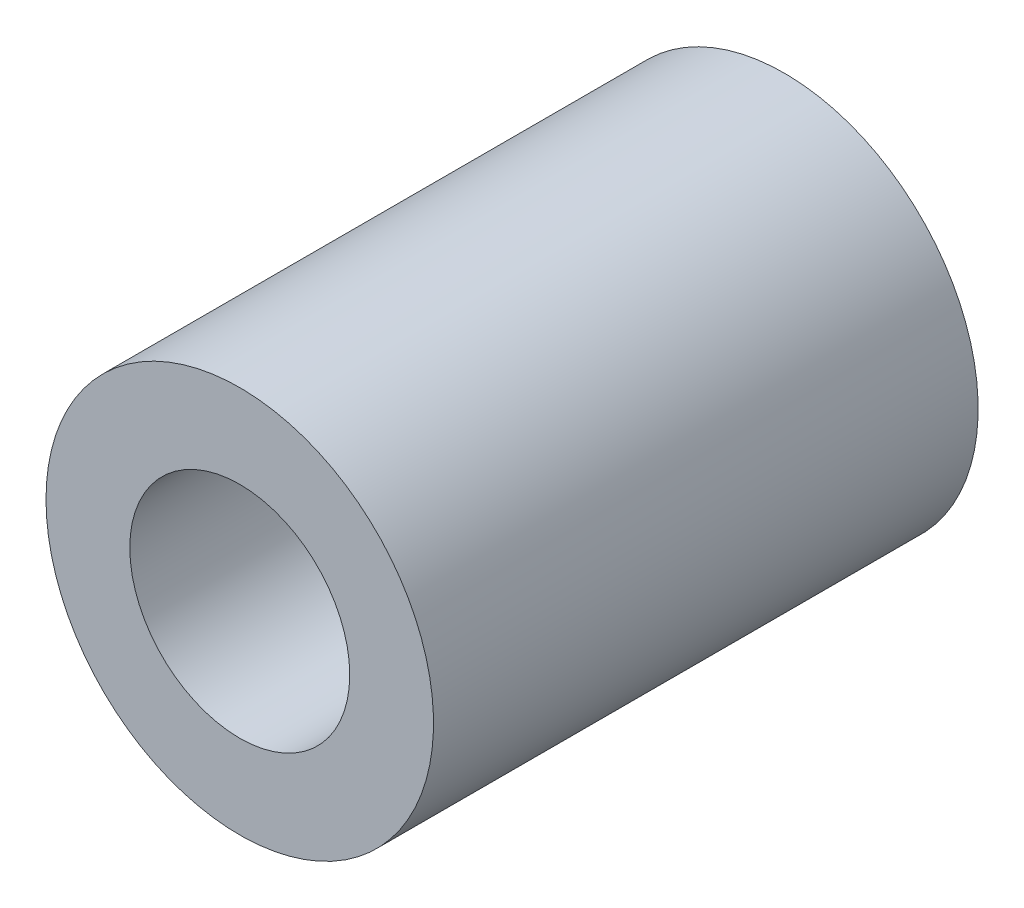
ISO-10303-21;
HEADER;
FILE_DESCRIPTION(('STEP AP214'),'2;1');
FILE_NAME('part.step','',(''),(''),'','','');
FILE_SCHEMA(('AUTOMOTIVE_DESIGN { 1 0 10303 214 1 1 1 1 }'));
ENDSEC;
DATA;
#1=APPLICATION_CONTEXT('core data for automotive mechanical design processes');
#2=APPLICATION_PROTOCOL_DEFINITION('international standard','automotive_design',2000,#1);
#3=PRODUCT_CONTEXT('',#1,'mechanical');
#4=PRODUCT('Part','Part','',(#3));
#5=PRODUCT_RELATED_PRODUCT_CATEGORY('part','',(#4));
#6=PRODUCT_DEFINITION_FORMATION('','',#4);
#7=PRODUCT_DEFINITION_CONTEXT('part definition',#1,'design');
#8=PRODUCT_DEFINITION('design','',#6,#7);
#9=PRODUCT_DEFINITION_SHAPE('','',#8);
#10=(LENGTH_UNIT() NAMED_UNIT(*) SI_UNIT(.MILLI.,.METRE.));
#11=(NAMED_UNIT(*) PLANE_ANGLE_UNIT() SI_UNIT($,.RADIAN.));
#12=(NAMED_UNIT(*) SI_UNIT($,.STERADIAN.) SOLID_ANGLE_UNIT());
#13=UNCERTAINTY_MEASURE_WITH_UNIT(LENGTH_MEASURE(1.E-05),#10,'distance_accuracy_value','');
#14=(GEOMETRIC_REPRESENTATION_CONTEXT(3) GLOBAL_UNCERTAINTY_ASSIGNED_CONTEXT((#13)) GLOBAL_UNIT_ASSIGNED_CONTEXT((#10,
#11,#12)) REPRESENTATION_CONTEXT('',''));
#15=CARTESIAN_POINT('',(0.,0.,0.));
#16=DIRECTION('',(0.,0.,1.));
#17=DIRECTION('',(1.,0.,0.));
#18=AXIS2_PLACEMENT_3D('',#15,#16,#17);
#19=CARTESIAN_POINT('',(5.5,8.176279441629,12.05));
#20=DIRECTION('',(0.,0.,-1.));
#21=DIRECTION('',(0.,-1.,0.));
#22=AXIS2_PLACEMENT_3D('',#19,#20,#21);
#23=PLANE('',#22);
#24=CARTESIAN_POINT('',(5.5,8.176279441629,12.05));
#25=DIRECTION('',(0.,0.,1.));
#26=DIRECTION('',(-1.,0.,0.));
#27=AXIS2_PLACEMENT_3D('',#24,#25,#26);
#28=CIRCLE('',#27,1.85);
#29=CARTESIAN_POINT('',(3.65,8.176279441629,12.05));
#30=VERTEX_POINT('',#29);
#31=EDGE_CURVE('E10',#30,#30,#28,.T.);
#32=ORIENTED_EDGE('',*,*,#31,.T.);
#33=EDGE_LOOP('',(#32));
#34=FACE_BOUND('',#33,.T.);
#35=CARTESIAN_POINT('',(5.5,8.176279441629,12.05));
#36=DIRECTION('',(0.,0.,-1.));
#37=DIRECTION('',(-1.,0.,0.));
#38=AXIS2_PLACEMENT_3D('',#35,#36,#37);
#39=CIRCLE('',#38,1.05);
#40=CARTESIAN_POINT('',(4.45,8.176279441629,12.05));
#41=VERTEX_POINT('',#40);
#42=EDGE_CURVE('E38',#41,#41,#39,.T.);
#43=ORIENTED_EDGE('',*,*,#42,.T.);
#44=EDGE_LOOP('',(#43));
#45=FACE_BOUND('',#44,.T.);
#46=ADVANCED_FACE('F14',(#34,#45),#23,.F.);
#47=CARTESIAN_POINT('',(5.5,8.176279441629,12.05));
#48=DIRECTION('',(0.,0.,-1.));
#49=DIRECTION('',(-1.,0.,0.));
#50=AXIS2_PLACEMENT_3D('',#47,#48,#49);
#51=CYLINDRICAL_SURFACE('',#50,1.85);
#52=CARTESIAN_POINT('',(5.5,8.176279441629,6.85));
#53=DIRECTION('',(0.,0.,-1.));
#54=DIRECTION('',(-1.,0.,0.));
#55=AXIS2_PLACEMENT_3D('',#52,#53,#54);
#56=CIRCLE('',#55,1.85);
#57=CARTESIAN_POINT('',(3.65,8.176279441629,6.85));
#58=VERTEX_POINT('',#57);
#59=EDGE_CURVE('E21',#58,#58,#56,.T.);
#60=ORIENTED_EDGE('',*,*,#59,.F.);
#61=EDGE_LOOP('',(#60));
#62=FACE_BOUND('',#61,.T.);
#63=ORIENTED_EDGE('',*,*,#31,.F.);
#64=EDGE_LOOP('',(#63));
#65=FACE_BOUND('',#64,.T.);
#66=ADVANCED_FACE('F56',(#62,#65),#51,.T.);
#67=CARTESIAN_POINT('',(5.5,8.176279441629,6.85));
#68=DIRECTION('',(0.,0.,-1.));
#69=DIRECTION('',(0.,-1.,0.));
#70=AXIS2_PLACEMENT_3D('',#67,#68,#69);
#71=PLANE('',#70);
#72=ORIENTED_EDGE('',*,*,#59,.T.);
#73=EDGE_LOOP('',(#72));
#74=FACE_BOUND('',#73,.T.);
#75=CARTESIAN_POINT('',(5.5,8.176279441629,6.85));
#76=DIRECTION('',(0.,0.,1.));
#77=DIRECTION('',(1.,0.,0.));
#78=AXIS2_PLACEMENT_3D('',#75,#76,#77);
#79=CIRCLE('',#78,1.05);
#80=CARTESIAN_POINT('',(6.55,8.176279441629,6.85));
#81=VERTEX_POINT('',#80);
#82=EDGE_CURVE('E30',#81,#81,#79,.T.);
#83=ORIENTED_EDGE('',*,*,#82,.T.);
#84=EDGE_LOOP('',(#83));
#85=FACE_BOUND('',#84,.T.);
#86=ADVANCED_FACE('F49',(#74,#85),#71,.T.);
#87=CARTESIAN_POINT('',(5.5,8.176279441629,12.05));
#88=DIRECTION('',(0.,0.,-1.));
#89=DIRECTION('',(-1.,0.,0.));
#90=AXIS2_PLACEMENT_3D('',#87,#88,#89);
#91=CYLINDRICAL_SURFACE('',#90,1.05);
#92=ORIENTED_EDGE('',*,*,#82,.F.);
#93=EDGE_LOOP('',(#92));
#94=FACE_BOUND('',#93,.T.);
#95=ORIENTED_EDGE('',*,*,#42,.F.);
#96=EDGE_LOOP('',(#95));
#97=FACE_BOUND('',#96,.T.);
#98=ADVANCED_FACE('F47',(#94,#97),#91,.F.);
#99=CLOSED_SHELL('',(#46,#66,#86,#98));
#100=MANIFOLD_SOLID_BREP('B1',#99);
#101=ADVANCED_BREP_SHAPE_REPRESENTATION('',(#18,#100),#14);
#102=SHAPE_DEFINITION_REPRESENTATION(#9,#101);
ENDSEC;
END-ISO-10303-21;
